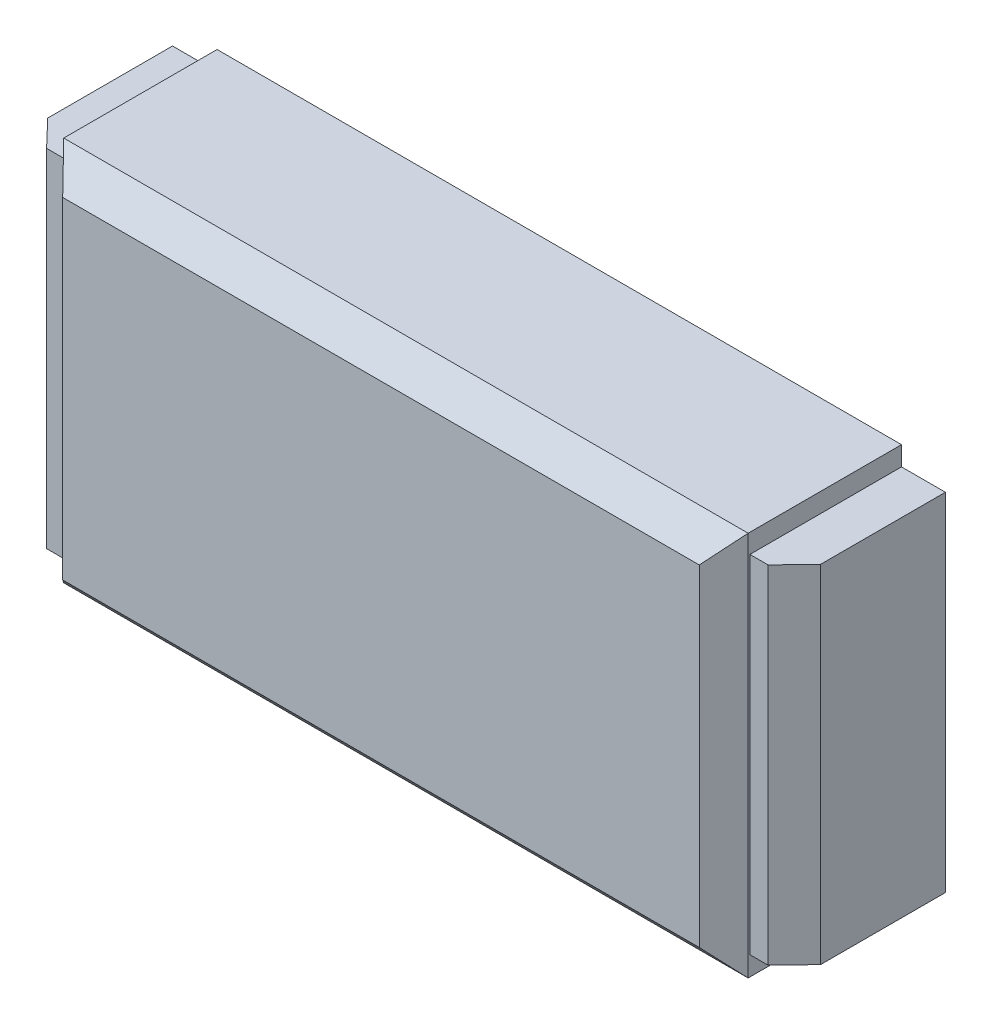
ISO-10303-21;
HEADER;
FILE_DESCRIPTION(('STEP AP214'),'2;1');
FILE_NAME('part.step','',(''),(''),'','','');
FILE_SCHEMA(('AUTOMOTIVE_DESIGN { 1 0 10303 214 1 1 1 1 }'));
ENDSEC;
DATA;
#1=APPLICATION_CONTEXT('core data for automotive mechanical design processes');
#2=APPLICATION_PROTOCOL_DEFINITION('international standard','automotive_design',2000,#1);
#3=PRODUCT_CONTEXT('',#1,'mechanical');
#4=PRODUCT('Part','Part','',(#3));
#5=PRODUCT_RELATED_PRODUCT_CATEGORY('part','',(#4));
#6=PRODUCT_DEFINITION_FORMATION('','',#4);
#7=PRODUCT_DEFINITION_CONTEXT('part definition',#1,'design');
#8=PRODUCT_DEFINITION('design','',#6,#7);
#9=PRODUCT_DEFINITION_SHAPE('','',#8);
#10=(LENGTH_UNIT() NAMED_UNIT(*) SI_UNIT(.MILLI.,.METRE.));
#11=(NAMED_UNIT(*) PLANE_ANGLE_UNIT() SI_UNIT($,.RADIAN.));
#12=(NAMED_UNIT(*) SI_UNIT($,.STERADIAN.) SOLID_ANGLE_UNIT());
#13=UNCERTAINTY_MEASURE_WITH_UNIT(LENGTH_MEASURE(1.E-05),#10,'distance_accuracy_value','');
#14=(GEOMETRIC_REPRESENTATION_CONTEXT(3) GLOBAL_UNCERTAINTY_ASSIGNED_CONTEXT((#13)) GLOBAL_UNIT_ASSIGNED_CONTEXT((#10,
#11,#12)) REPRESENTATION_CONTEXT('',''));
#15=CARTESIAN_POINT('',(0.,0.,0.));
#16=DIRECTION('',(0.,0.,1.));
#17=DIRECTION('',(1.,0.,0.));
#18=AXIS2_PLACEMENT_3D('',#15,#16,#17);
#19=CARTESIAN_POINT('',(3.83298483211547,0.0649199937470257,0.0240552999457575));
#20=DIRECTION('',(-0.999999999994836,1.28751508300798E-06,-2.94461463104024E-06));
#21=DIRECTION('',(-2.94461463104268E-06,0.,0.999999999995665));
#22=AXIS2_PLACEMENT_3D('',#19,#20,#21);
#23=PLANE('',#22);
#24=DIRECTION('',(2.57503016602073E-06,0.999999999996685,0.));
#25=VECTOR('',#24,1.);
#26=CARTESIAN_POINT('',(3.83297982625663,-1.87908008228987,0.0240552999457577));
#27=LINE('',#26,#25);
#28=CARTESIAN_POINT('',(3.83297982625663,-1.87908008228987,0.0240552999457577));
#29=VERTEX_POINT('',#28);
#30=CARTESIAN_POINT('',(3.83298983797431,2.00892006978393,0.0240552999457576));
#31=VERTEX_POINT('',#30);
#32=EDGE_CURVE('P0_E69',#29,#31,#27,.T.);
#33=ORIENTED_EDGE('',*,*,#32,.F.);
#34=DIRECTION('',(0.,0.,-1.));
#35=VECTOR('',#34,1.);
#36=CARTESIAN_POINT('',(3.83297982625663,-1.87908008228987,1.72406004276127));
#37=LINE('',#36,#35);
#38=CARTESIAN_POINT('',(3.83297982625663,-1.87908008228987,1.72406004276127));
#39=VERTEX_POINT('',#38);
#40=EDGE_CURVE('P0_E57',#39,#29,#37,.T.);
#41=ORIENTED_EDGE('',*,*,#40,.F.);
#42=DIRECTION('',(0.,-1.,0.));
#43=VECTOR('',#42,1.);
#44=CARTESIAN_POINT('',(3.83297982625663,2.00892006978393,1.72406004276127));
#45=LINE('',#44,#43);
#46=CARTESIAN_POINT('',(3.83297982625663,2.00892006978393,1.72406004276127));
#47=VERTEX_POINT('',#46);
#48=EDGE_CURVE('P0_E19',#47,#39,#45,.T.);
#49=ORIENTED_EDGE('',*,*,#48,.F.);
#50=DIRECTION('',(-5.88922926200877E-06,0.,0.999999999982659));
#51=VECTOR('',#50,1.);
#52=CARTESIAN_POINT('',(3.83298983797431,2.00892006978393,0.0240552999457577));
#53=LINE('',#52,#51);
#54=EDGE_CURVE('P0_E81',#31,#47,#53,.T.);
#55=ORIENTED_EDGE('',*,*,#54,.F.);
#56=EDGE_LOOP('',(#33,#41,#49,#55));
#57=FACE_BOUND('',#56,.T.);
#58=ADVANCED_FACE('P0_F16',(#57),#23,.T.);
#59=CARTESIAN_POINT('',(0.,0.,1.72406004276127));
#60=DIRECTION('',(0.,0.,1.));
#61=DIRECTION('',(1.,0.,0.));
#62=AXIS2_PLACEMENT_3D('',#59,#60,#61);
#63=PLANE('',#62);
#64=ORIENTED_EDGE('',*,*,#48,.T.);
#65=DIRECTION('',(-1.,0.,0.));
#66=VECTOR('',#65,1.);
#67=CARTESIAN_POINT('',(4.04488993808627,-1.87908008228987,1.72406004276127));
#68=LINE('',#67,#66);
#69=CARTESIAN_POINT('',(4.04488993808627,-1.87908008228987,1.72406004276127));
#70=VERTEX_POINT('',#69);
#71=EDGE_CURVE('P0_E64',#70,#39,#68,.T.);
#72=ORIENTED_EDGE('',*,*,#71,.F.);
#73=DIRECTION('',(0.,-1.,0.));
#74=VECTOR('',#73,1.);
#75=CARTESIAN_POINT('',(4.04488993808627,2.00892006978393,1.72406004276127));
#76=LINE('',#75,#74);
#77=CARTESIAN_POINT('',(4.04488993808627,2.00892006978393,1.72406004276127));
#78=VERTEX_POINT('',#77);
#79=EDGE_CURVE('P0_E87',#78,#70,#76,.T.);
#80=ORIENTED_EDGE('',*,*,#79,.F.);
#81=DIRECTION('',(1.,0.,0.));
#82=VECTOR('',#81,1.);
#83=CARTESIAN_POINT('',(3.83297982625663,2.00892006978393,1.72406004276127));
#84=LINE('',#83,#82);
#85=EDGE_CURVE('P0_E65',#47,#78,#84,.T.);
#86=ORIENTED_EDGE('',*,*,#85,.F.);
#87=EDGE_LOOP('',(#64,#72,#80,#86));
#88=FACE_BOUND('',#87,.T.);
#89=ADVANCED_FACE('P0_F62',(#88),#63,.T.);
#90=CARTESIAN_POINT('',(0.,-1.87908008228987,0.));
#91=DIRECTION('',(0.,-1.,0.));
#92=DIRECTION('',(0.,0.,-1.));
#93=AXIS2_PLACEMENT_3D('',#90,#91,#92);
#94=PLANE('',#93);
#95=DIRECTION('',(-0.99999999999902,0.,-1.40039793707643E-06));
#96=VECTOR('',#95,1.);
#97=CARTESIAN_POINT('',(4.33305976912379,-1.87908008228987,0.0240560002566781));
#98=LINE('',#97,#96);
#99=CARTESIAN_POINT('',(4.33305976912379,-1.87908008228987,0.0240560002566781));
#100=VERTEX_POINT('',#99);
#101=EDGE_CURVE('P0_E71',#100,#29,#98,.T.);
#102=ORIENTED_EDGE('',*,*,#101,.F.);
#103=DIRECTION('',(0.,0.,-1.));
#104=VECTOR('',#103,1.);
#105=CARTESIAN_POINT('',(4.33305976912379,-1.87908008228987,1.42325996421278));
#106=LINE('',#105,#104);
#107=CARTESIAN_POINT('',(4.33305976912379,-1.87908008228987,1.42325996421278));
#108=VERTEX_POINT('',#107);
#109=EDGE_CURVE('P0_E34',#108,#100,#106,.T.);
#110=ORIENTED_EDGE('',*,*,#109,.F.);
#111=DIRECTION('',(0.691784083048146,0.,-0.722104412423325));
#112=VECTOR('',#111,1.);
#113=CARTESIAN_POINT('',(4.04488993808627,-1.87908008228987,1.72406004276127));
#114=LINE('',#113,#112);
#115=EDGE_CURVE('P0_E73',#70,#108,#114,.T.);
#116=ORIENTED_EDGE('',*,*,#115,.F.);
#117=ORIENTED_EDGE('',*,*,#71,.T.);
#118=ORIENTED_EDGE('',*,*,#40,.T.);
#119=EDGE_LOOP('',(#102,#110,#116,#117,#118));
#120=FACE_BOUND('',#119,.T.);
#121=ADVANCED_FACE('P0_F72',(#120),#94,.T.);
#122=CARTESIAN_POINT('',(4.33305976912379,0.0649199937470257,0.0240560002566781));
#123=DIRECTION('',(1.40041195536423E-06,-1.80305151496546E-12,-0.999999999999019));
#124=DIRECTION('',(-0.99999999999902,0.,-1.40041195536423E-06));
#125=AXIS2_PLACEMENT_3D('',#122,#123,#124);
#126=PLANE('',#125);
#127=DIRECTION('',(0.,1.,0.));
#128=VECTOR('',#127,1.);
#129=CARTESIAN_POINT('',(4.33305976912379,-1.87908008228987,0.0240560002566781));
#130=LINE('',#129,#128);
#131=CARTESIAN_POINT('',(4.33305976912379,2.00892006978393,0.0240560002566781));
#132=VERTEX_POINT('',#131);
#133=EDGE_CURVE('P0_E91',#100,#132,#130,.T.);
#134=ORIENTED_EDGE('',*,*,#133,.F.);
#135=ORIENTED_EDGE('',*,*,#101,.T.);
#136=ORIENTED_EDGE('',*,*,#32,.T.);
#137=DIRECTION('',(-0.99999999999902,0.,-1.40042597393269E-06));
#138=VECTOR('',#137,1.);
#139=CARTESIAN_POINT('',(4.33305976912379,2.00892006978393,0.0240560002566781));
#140=LINE('',#139,#138);
#141=EDGE_CURVE('P0_E78',#132,#31,#140,.T.);
#142=ORIENTED_EDGE('',*,*,#141,.F.);
#143=EDGE_LOOP('',(#134,#135,#136,#142));
#144=FACE_BOUND('',#143,.T.);
#145=ADVANCED_FACE('P0_F102',(#144),#126,.T.);
#146=CARTESIAN_POINT('',(0.,2.00892006978393,0.));
#147=DIRECTION('',(0.,-1.,0.));
#148=DIRECTION('',(0.,0.,-1.));
#149=AXIS2_PLACEMENT_3D('',#146,#147,#148);
#150=PLANE('',#149);
#151=DIRECTION('',(0.,0.,1.));
#152=VECTOR('',#151,1.);
#153=CARTESIAN_POINT('',(4.33305976912379,2.00892006978393,0.0240560002566781));
#154=LINE('',#153,#152);
#155=CARTESIAN_POINT('',(4.33305976912379,2.00892006978393,1.42325996421278));
#156=VERTEX_POINT('',#155);
#157=EDGE_CURVE('P0_E25',#132,#156,#154,.T.);
#158=ORIENTED_EDGE('',*,*,#157,.F.);
#159=ORIENTED_EDGE('',*,*,#141,.T.);
#160=ORIENTED_EDGE('',*,*,#54,.T.);
#161=ORIENTED_EDGE('',*,*,#85,.T.);
#162=DIRECTION('',(-0.691784083048146,0.,0.722104412423325));
#163=VECTOR('',#162,1.);
#164=CARTESIAN_POINT('',(4.33305976912379,2.00892006978393,1.42325996421278));
#165=LINE('',#164,#163);
#166=EDGE_CURVE('P0_E86',#156,#78,#165,.T.);
#167=ORIENTED_EDGE('',*,*,#166,.F.);
#168=EDGE_LOOP('',(#158,#159,#160,#161,#167));
#169=FACE_BOUND('',#168,.T.);
#170=ADVANCED_FACE('P0_F105',(#169),#150,.F.);
#171=CARTESIAN_POINT('',(2.97038384276018,0.,2.8456608595825));
#172=DIRECTION('',(0.722104412423325,0.,0.691784083048146));
#173=DIRECTION('',(0.691784083048146,0.,-0.722104412423325));
#174=AXIS2_PLACEMENT_3D('',#171,#172,#173);
#175=PLANE('',#174);
#176=ORIENTED_EDGE('',*,*,#115,.T.);
#177=DIRECTION('',(0.,-1.,0.));
#178=VECTOR('',#177,1.);
#179=CARTESIAN_POINT('',(4.33305976912379,2.00892006978393,1.42325996421278));
#180=LINE('',#179,#178);
#181=EDGE_CURVE('P0_E10',#156,#108,#180,.T.);
#182=ORIENTED_EDGE('',*,*,#181,.F.);
#183=ORIENTED_EDGE('',*,*,#166,.T.);
#184=ORIENTED_EDGE('',*,*,#79,.T.);
#185=EDGE_LOOP('',(#176,#182,#183,#184));
#186=FACE_BOUND('',#185,.T.);
#187=ADVANCED_FACE('P0_F108',(#186),#175,.T.);
#188=CARTESIAN_POINT('',(4.33305976912379,0.,0.));
#189=DIRECTION('',(1.,0.,0.));
#190=DIRECTION('',(0.,0.,-1.));
#191=AXIS2_PLACEMENT_3D('',#188,#189,#190);
#192=PLANE('',#191);
#193=ORIENTED_EDGE('',*,*,#109,.T.);
#194=ORIENTED_EDGE('',*,*,#133,.T.);
#195=ORIENTED_EDGE('',*,*,#157,.T.);
#196=ORIENTED_EDGE('',*,*,#181,.T.);
#197=EDGE_LOOP('',(#193,#194,#195,#196));
#198=FACE_BOUND('',#197,.T.);
#199=ADVANCED_FACE('P0_F98',(#198),#192,.T.);
#200=CLOSED_SHELL('',(#58,#89,#121,#145,#170,#187,#199));
#201=MANIFOLD_SOLID_BREP('P0_B1',#200);
#202=CARTESIAN_POINT('',(0.,2.0089300815016,0.));
#203=DIRECTION('',(0.,1.,0.));
#204=DIRECTION('',(0.,0.,1.));
#205=AXIS2_PLACEMENT_3D('',#202,#203,#204);
#206=PLANE('',#205);
#207=DIRECTION('',(-1.,0.,0.));
#208=VECTOR('',#207,1.);
#209=CARTESIAN_POINT('',(-3.83867998607457,2.0089300815016,1.72404001932591));
#210=LINE('',#209,#208);
#211=CARTESIAN_POINT('',(-3.83867998607457,2.0089300815016,1.72404001932591));
#212=VERTEX_POINT('',#211);
#213=CARTESIAN_POINT('',(-4.04714001342654,2.0089300815016,1.72404001932591));
#214=VERTEX_POINT('',#213);
#215=EDGE_CURVE('P1_E68',#212,#214,#210,.T.);
#216=ORIENTED_EDGE('',*,*,#215,.F.);
#217=DIRECTION('',(0.,0.,1.));
#218=VECTOR('',#217,1.);
#219=CARTESIAN_POINT('',(-3.83867998607457,2.0089300815016,0.0240447006945033));
#220=LINE('',#219,#218);
#221=CARTESIAN_POINT('',(-3.83867998607457,2.0089300815016,0.0240447006945033));
#222=VERTEX_POINT('',#221);
#223=EDGE_CURVE('P1_E57',#222,#212,#220,.T.);
#224=ORIENTED_EDGE('',*,*,#223,.F.);
#225=DIRECTION('',(0.999999999999004,0.,1.41123403875834E-06));
#226=VECTOR('',#225,1.);
#227=CARTESIAN_POINT('',(-4.33492008596659,2.0089300815016,0.0240440003835829));
#228=LINE('',#227,#226);
#229=CARTESIAN_POINT('',(-4.33492008596659,2.0089300815016,0.0240440003835829));
#230=VERTEX_POINT('',#229);
#231=EDGE_CURVE('P1_E20',#230,#222,#228,.T.);
#232=ORIENTED_EDGE('',*,*,#231,.F.);
#233=DIRECTION('',(0.,0.,-1.));
#234=VECTOR('',#233,1.);
#235=CARTESIAN_POINT('',(-4.33492008596659,2.0089300815016,1.42364006023854));
#236=LINE('',#235,#234);
#237=CARTESIAN_POINT('',(-4.33492008596659,2.0089300815016,1.42364006023854));
#238=VERTEX_POINT('',#237);
#239=EDGE_CURVE('P1_E85',#238,#230,#236,.T.);
#240=ORIENTED_EDGE('',*,*,#239,.F.);
#241=DIRECTION('',(-0.691776011342532,0.,-0.722112145120837));
#242=VECTOR('',#241,1.);
#243=CARTESIAN_POINT('',(-4.04714001342654,2.0089300815016,1.72404001932591));
#244=LINE('',#243,#242);
#245=EDGE_CURVE('P1_E79',#214,#238,#244,.T.);
#246=ORIENTED_EDGE('',*,*,#245,.F.);
#247=EDGE_LOOP('',(#216,#224,#232,#240,#246));
#248=FACE_BOUND('',#247,.T.);
#249=ADVANCED_FACE('P1_F17',(#248),#206,.T.);
#250=CARTESIAN_POINT('',(-3.83867998607457,0.0649300054647028,0.0240447006945033));
#251=DIRECTION('',(1.41122013403533E-06,-1.77471215667501E-12,-0.999999999999004));
#252=DIRECTION('',(-0.999999999999004,0.,-1.41122013403533E-06));
#253=AXIS2_PLACEMENT_3D('',#250,#251,#252);
#254=PLANE('',#253);
#255=DIRECTION('',(0.,1.,0.));
#256=VECTOR('',#255,1.);
#257=CARTESIAN_POINT('',(-3.83867998607457,-1.8790700705722,0.0240447006945033));
#258=LINE('',#257,#256);
#259=CARTESIAN_POINT('',(-3.83867998607457,-1.8790700705722,0.0240447006945033));
#260=VERTEX_POINT('',#259);
#261=EDGE_CURVE('P1_E61',#260,#222,#258,.T.);
#262=ORIENTED_EDGE('',*,*,#261,.F.);
#263=DIRECTION('',(0.999999999999004,0.,1.41120622958632E-06));
#264=VECTOR('',#263,1.);
#265=CARTESIAN_POINT('',(-4.33492986485362,-1.8790700705722,0.0240440003835829));
#266=LINE('',#265,#264);
#267=CARTESIAN_POINT('',(-4.33492986485362,-1.8790700705722,0.0240440003835829));
#268=VERTEX_POINT('',#267);
#269=EDGE_CURVE('P1_E35',#268,#260,#266,.T.);
#270=ORIENTED_EDGE('',*,*,#269,.F.);
#271=DIRECTION('',(-2.51514574355551E-06,-0.999999999996837,0.));
#272=VECTOR('',#271,1.);
#273=CARTESIAN_POINT('',(-4.33492008596659,2.0089300815016,0.0240440003835829));
#274=LINE('',#273,#272);
#275=EDGE_CURVE('P1_E63',#230,#268,#274,.T.);
#276=ORIENTED_EDGE('',*,*,#275,.F.);
#277=ORIENTED_EDGE('',*,*,#231,.T.);
#278=EDGE_LOOP('',(#262,#270,#276,#277));
#279=FACE_BOUND('',#278,.T.);
#280=ADVANCED_FACE('P1_F60',(#279),#254,.T.);
#281=CARTESIAN_POINT('',(-3.83868499193341,-1.8790700705722,0.874042360010208));
#282=DIRECTION('',(0.999999999994836,-1.28751508300798E-06,2.94463095496189E-06));
#283=DIRECTION('',(2.94463095496433E-06,0.,-0.999999999995665));
#284=AXIS2_PLACEMENT_3D('',#281,#282,#283);
#285=PLANE('',#284);
#286=DIRECTION('',(-5.88926190985206E-06,0.,0.999999999982658));
#287=VECTOR('',#286,1.);
#288=CARTESIAN_POINT('',(-3.83867998607457,-1.8790700705722,0.0240447006945033));
#289=LINE('',#288,#287);
#290=CARTESIAN_POINT('',(-3.83868999779224,-1.8790700705722,1.72404001932591));
#291=VERTEX_POINT('',#290);
#292=EDGE_CURVE('P1_E73',#260,#291,#289,.T.);
#293=ORIENTED_EDGE('',*,*,#292,.F.);
#294=ORIENTED_EDGE('',*,*,#261,.T.);
#295=ORIENTED_EDGE('',*,*,#223,.T.);
#296=DIRECTION('',(2.57503016602073E-06,0.999999999996685,0.));
#297=VECTOR('',#296,1.);
#298=CARTESIAN_POINT('',(-3.83868999779224,-1.8790700705722,1.72404001932591));
#299=LINE('',#298,#297);
#300=EDGE_CURVE('P1_E70',#291,#212,#299,.T.);
#301=ORIENTED_EDGE('',*,*,#300,.F.);
#302=EDGE_LOOP('',(#293,#294,#295,#301));
#303=FACE_BOUND('',#302,.T.);
#304=ADVANCED_FACE('P1_F71',(#303),#285,.T.);
#305=CARTESIAN_POINT('',(0.,0.,1.72404001932591));
#306=DIRECTION('',(0.,0.,1.));
#307=DIRECTION('',(1.,0.,0.));
#308=AXIS2_PLACEMENT_3D('',#305,#306,#307);
#309=PLANE('',#308);
#310=DIRECTION('',(-1.,0.,0.));
#311=VECTOR('',#310,1.);
#312=CARTESIAN_POINT('',(-3.83868999779224,-1.8790700705722,1.72404001932591));
#313=LINE('',#312,#311);
#314=CARTESIAN_POINT('',(-4.04715025797486,-1.8790700705722,1.72404001932591));
#315=VERTEX_POINT('',#314);
#316=EDGE_CURVE('P1_E92',#291,#315,#313,.T.);
#317=ORIENTED_EDGE('',*,*,#316,.F.);
#318=ORIENTED_EDGE('',*,*,#300,.T.);
#319=ORIENTED_EDGE('',*,*,#215,.T.);
#320=DIRECTION('',(2.63491458848591E-06,0.999999999996529,0.));
#321=VECTOR('',#320,1.);
#322=CARTESIAN_POINT('',(-4.04715025797486,-1.8790700705722,1.72404001932591));
#323=LINE('',#322,#321);
#324=EDGE_CURVE('P1_E77',#315,#214,#323,.T.);
#325=ORIENTED_EDGE('',*,*,#324,.F.);
#326=EDGE_LOOP('',(#317,#318,#319,#325));
#327=FACE_BOUND('',#326,.T.);
#328=ADVANCED_FACE('P1_F104',(#327),#309,.T.);
#329=CARTESIAN_POINT('',(-4.3349249754101,0.0649300054647028,1.42364006023854));
#330=DIRECTION('',(-0.72211242470541,1.85946127688096E-06,0.691775719494849));
#331=DIRECTION('',(0.691775719496045,0.,0.722112424706658));
#332=AXIS2_PLACEMENT_3D('',#329,#330,#331);
#333=PLANE('',#332);
#334=DIRECTION('',(-0.691775427649219,0.,-0.722112704292578));
#335=VECTOR('',#334,1.);
#336=CARTESIAN_POINT('',(-4.04715025797486,-1.8790700705722,1.72404001932591));
#337=LINE('',#336,#335);
#338=CARTESIAN_POINT('',(-4.33492986485362,-1.8790700705722,1.42364006023854));
#339=VERTEX_POINT('',#338);
#340=EDGE_CURVE('P1_E26',#315,#339,#337,.T.);
#341=ORIENTED_EDGE('',*,*,#340,.F.);
#342=ORIENTED_EDGE('',*,*,#324,.T.);
#343=ORIENTED_EDGE('',*,*,#245,.T.);
#344=DIRECTION('',(2.51514574355551E-06,0.999999999996837,0.));
#345=VECTOR('',#344,1.);
#346=CARTESIAN_POINT('',(-4.33492986485362,-1.8790700705722,1.42364006023854));
#347=LINE('',#346,#345);
#348=EDGE_CURVE('P1_E84',#339,#238,#347,.T.);
#349=ORIENTED_EDGE('',*,*,#348,.F.);
#350=EDGE_LOOP('',(#341,#342,#343,#349));
#351=FACE_BOUND('',#350,.T.);
#352=ADVANCED_FACE('P1_F106',(#351),#333,.T.);
#353=CARTESIAN_POINT('',(-4.33492513869111,1.09029685112452E-05,0.));
#354=DIRECTION('',(-0.999999999996837,2.51514574355551E-06,0.));
#355=DIRECTION('',(-2.51514574355551E-06,-0.999999999996837,0.));
#356=AXIS2_PLACEMENT_3D('',#353,#354,#355);
#357=PLANE('',#356);
#358=ORIENTED_EDGE('',*,*,#275,.T.);
#359=DIRECTION('',(0.,0.,-1.));
#360=VECTOR('',#359,1.);
#361=CARTESIAN_POINT('',(-4.33492986485362,-1.8790700705722,1.42364006023854));
#362=LINE('',#361,#360);
#363=EDGE_CURVE('P1_E11',#339,#268,#362,.T.);
#364=ORIENTED_EDGE('',*,*,#363,.F.);
#365=ORIENTED_EDGE('',*,*,#348,.T.);
#366=ORIENTED_EDGE('',*,*,#239,.T.);
#367=EDGE_LOOP('',(#358,#364,#365,#366));
#368=FACE_BOUND('',#367,.T.);
#369=ADVANCED_FACE('P1_F109',(#368),#357,.T.);
#370=CARTESIAN_POINT('',(0.,-1.8790700705722,0.));
#371=DIRECTION('',(0.,1.,0.));
#372=DIRECTION('',(0.,0.,1.));
#373=AXIS2_PLACEMENT_3D('',#370,#371,#372);
#374=PLANE('',#373);
#375=ORIENTED_EDGE('',*,*,#269,.T.);
#376=ORIENTED_EDGE('',*,*,#292,.T.);
#377=ORIENTED_EDGE('',*,*,#316,.T.);
#378=ORIENTED_EDGE('',*,*,#340,.T.);
#379=ORIENTED_EDGE('',*,*,#363,.T.);
#380=EDGE_LOOP('',(#375,#376,#377,#378,#379));
#381=FACE_BOUND('',#380,.T.);
#382=ADVANCED_FACE('P1_F97',(#381),#374,.F.);
#383=CLOSED_SHELL('',(#249,#280,#304,#328,#352,#369,#382));
#384=MANIFOLD_SOLID_BREP('P1_B1',#383);
#385=CARTESIAN_POINT('',(-2.87093185497996,0.,2.75025395369583));
#386=DIRECTION('',(-0.722120846058626,0.,0.691766928732195));
#387=DIRECTION('',(0.691766928732195,0.,0.722120846058626));
#388=AXIS2_PLACEMENT_3D('',#385,#386,#387);
#389=PLANE('',#388);
#390=DIRECTION('',(0.,1.,0.));
#391=VECTOR('',#390,1.);
#392=CARTESIAN_POINT('',(-3.8348501548171,-2.09506996907294,1.74404005520046));
#393=LINE('',#392,#391);
#394=CARTESIAN_POINT('',(-3.8348501548171,-2.09506996907294,1.74404005520046));
#395=VERTEX_POINT('',#394);
#396=CARTESIAN_POINT('',(-3.8348501548171,2.22493009641767,1.74404005520046));
#397=VERTEX_POINT('',#396);
#398=EDGE_CURVE('P2_E20',#395,#397,#393,.T.);
#399=ORIENTED_EDGE('',*,*,#398,.F.);
#400=DIRECTION('',(-0.54549620124834,-0.614964364679721,-0.569431931487599));
#401=VECTOR('',#400,1.);
#402=CARTESIAN_POINT('',(-3.56661016121507,-1.79266999475658,2.02405010350049));
#403=LINE('',#402,#401);
#404=CARTESIAN_POINT('',(-3.56661016121507,-1.79266999475658,2.02405010350049));
#405=VERTEX_POINT('',#404);
#406=EDGE_CURVE('P2_E67',#405,#395,#403,.T.);
#407=ORIENTED_EDGE('',*,*,#406,.F.);
#408=DIRECTION('',(0.,-1.,0.));
#409=VECTOR('',#408,1.);
#410=CARTESIAN_POINT('',(-3.56661016121507,1.92253000568599,2.02405010350049));
#411=LINE('',#410,#409);
#412=CARTESIAN_POINT('',(-3.56661016121507,1.92253000568599,2.02405010350049));
#413=VERTEX_POINT('',#412);
#414=EDGE_CURVE('P2_E70',#413,#405,#411,.T.);
#415=ORIENTED_EDGE('',*,*,#414,.F.);
#416=DIRECTION('',(0.545496121830145,-0.614964511891349,0.569431848584627));
#417=VECTOR('',#416,1.);
#418=CARTESIAN_POINT('',(-3.8348501548171,2.22493009641767,1.74404005520046));
#419=LINE('',#418,#417);
#420=EDGE_CURVE('P2_E63',#397,#413,#419,.T.);
#421=ORIENTED_EDGE('',*,*,#420,.F.);
#422=EDGE_LOOP('',(#399,#407,#415,#421));
#423=FACE_BOUND('',#422,.T.);
#424=ADVANCED_FACE('P2_F17',(#423),#389,.T.);
#425=CARTESIAN_POINT('',(-3.8348501548171,0.,0.));
#426=DIRECTION('',(-1.,0.,0.));
#427=DIRECTION('',(0.,0.,1.));
#428=AXIS2_PLACEMENT_3D('',#425,#426,#427);
#429=PLANE('',#428);
#430=DIRECTION('',(0.,1.,0.));
#431=VECTOR('',#430,1.);
#432=CARTESIAN_POINT('',(-3.8348501548171,-2.09506996907294,0.0240447006945033));
#433=LINE('',#432,#431);
#434=CARTESIAN_POINT('',(-3.8348501548171,-2.09506996907294,0.0240447006945033));
#435=VERTEX_POINT('',#434);
#436=CARTESIAN_POINT('',(-3.8348501548171,2.22493009641767,0.0240447006945033));
#437=VERTEX_POINT('',#436);
#438=EDGE_CURVE('P2_E93',#435,#437,#433,.T.);
#439=ORIENTED_EDGE('',*,*,#438,.F.);
#440=DIRECTION('',(0.,0.,-1.));
#441=VECTOR('',#440,1.);
#442=CARTESIAN_POINT('',(-3.8348501548171,-2.09506996907294,1.74404005520046));
#443=LINE('',#442,#441);
#444=EDGE_CURVE('P2_E86',#395,#435,#443,.T.);
#445=ORIENTED_EDGE('',*,*,#444,.F.);
#446=ORIENTED_EDGE('',*,*,#398,.T.);
#447=DIRECTION('',(0.,0.,1.));
#448=VECTOR('',#447,1.);
#449=CARTESIAN_POINT('',(-3.8348501548171,2.22493009641767,0.0240447006945033));
#450=LINE('',#449,#448);
#451=EDGE_CURVE('P2_E101',#437,#397,#450,.T.);
#452=ORIENTED_EDGE('',*,*,#451,.F.);
#453=EDGE_LOOP('',(#439,#445,#446,#452));
#454=FACE_BOUND('',#453,.T.);
#455=ADVANCED_FACE('P2_F133',(#454),#429,.T.);
#456=CARTESIAN_POINT('',(3.70652007404715,-1.94387999363244,1.88405509106815));
#457=DIRECTION('',(-1.91005376151348E-06,-0.67940811035651,0.733760600998818));
#458=DIRECTION('',(0.,-0.733760601000157,-0.67940811035775));
#459=AXIS2_PLACEMENT_3D('',#456,#457,#458);
#460=PLANE('',#459);
#461=DIRECTION('',(-0.999999999995747,1.30437503463243E-06,-2.60875006926487E-06));
#462=VECTOR('',#461,1.);
#463=CARTESIAN_POINT('',(3.84063995443285,-2.09507998079062,1.74406007863581));
#464=LINE('',#463,#462);
#465=CARTESIAN_POINT('',(3.84063995443285,-2.09507998079062,1.74406007863581));
#466=VERTEX_POINT('',#465);
#467=EDGE_CURVE('P2_E35',#466,#395,#464,.T.);
#468=ORIENTED_EDGE('',*,*,#467,.F.);
#469=DIRECTION('',(0.545508517179408,-0.614978782824802,-0.569404561239238));
#470=VECTOR('',#469,1.);
#471=CARTESIAN_POINT('',(3.57240019366145,-1.79268000647426,2.02405010350049));
#472=LINE('',#471,#470);
#473=CARTESIAN_POINT('',(3.57240019366145,-1.79268000647426,2.02405010350049));
#474=VERTEX_POINT('',#473);
#475=EDGE_CURVE('P2_E78',#474,#466,#472,.T.);
#476=ORIENTED_EDGE('',*,*,#475,.F.);
#477=DIRECTION('',(0.999999999999017,-1.40239573546321E-06,0.));
#478=VECTOR('',#477,1.);
#479=CARTESIAN_POINT('',(-3.56661016121507,-1.79266999475658,2.02405010350049));
#480=LINE('',#479,#478);
#481=EDGE_CURVE('P2_E75',#405,#474,#480,.T.);
#482=ORIENTED_EDGE('',*,*,#481,.F.);
#483=ORIENTED_EDGE('',*,*,#406,.T.);
#484=EDGE_LOOP('',(#468,#476,#482,#483));
#485=FACE_BOUND('',#484,.T.);
#486=ADVANCED_FACE('P2_F76',(#485),#460,.T.);
#487=CARTESIAN_POINT('',(3.70653008576483,2.07372003933415,1.88405509106815));
#488=DIRECTION('',(-7.34636679058502E-08,0.679407969536992,0.733760731389747));
#489=DIRECTION('',(0.,-0.733760731389749,0.679407969536994));
#490=AXIS2_PLACEMENT_3D('',#487,#488,#489);
#491=PLANE('',#490);
#492=DIRECTION('',(-0.545508437755695,-0.614978930035684,0.569404478336364));
#493=VECTOR('',#492,1.);
#494=CARTESIAN_POINT('',(3.84064996615052,2.22492008469999,1.74406007863581));
#495=LINE('',#494,#493);
#496=CARTESIAN_POINT('',(3.84064996615052,2.22492008469999,1.74406007863581));
#497=VERTEX_POINT('',#496);
#498=CARTESIAN_POINT('',(3.57241020537913,1.92251999396831,2.02405010350049));
#499=VERTEX_POINT('',#498);
#500=EDGE_CURVE('P2_E107',#497,#499,#495,.T.);
#501=ORIENTED_EDGE('',*,*,#500,.F.);
#502=DIRECTION('',(0.999999999995747,-1.30437333324042E-06,2.60874666648085E-06));
#503=VECTOR('',#502,1.);
#504=CARTESIAN_POINT('',(-3.8348501548171,2.22493009641767,1.74404005520046));
#505=LINE('',#504,#503);
#506=EDGE_CURVE('P2_E98',#397,#497,#505,.T.);
#507=ORIENTED_EDGE('',*,*,#506,.F.);
#508=ORIENTED_EDGE('',*,*,#420,.T.);
#509=DIRECTION('',(-0.999999999999017,1.40239376875217E-06,0.));
#510=VECTOR('',#509,1.);
#511=CARTESIAN_POINT('',(3.57241020537913,1.92251999396831,2.02405010350049));
#512=LINE('',#511,#510);
#513=EDGE_CURVE('P2_E82',#499,#413,#512,.T.);
#514=ORIENTED_EDGE('',*,*,#513,.F.);
#515=EDGE_LOOP('',(#501,#507,#508,#514));
#516=FACE_BOUND('',#515,.T.);
#517=ADVANCED_FACE('P2_F139',(#516),#491,.T.);
#518=CARTESIAN_POINT('',(0.,0.,2.02405010350049));
#519=DIRECTION('',(0.,0.,1.));
#520=DIRECTION('',(1.,0.,0.));
#521=AXIS2_PLACEMENT_3D('',#518,#519,#520);
#522=PLANE('',#521);
#523=ORIENTED_EDGE('',*,*,#481,.T.);
#524=DIRECTION('',(-2.69479911603344E-06,-0.999999999996369,0.));
#525=VECTOR('',#524,1.);
#526=CARTESIAN_POINT('',(3.57241020537913,1.92251999396831,2.02405010350049));
#527=LINE('',#526,#525);
#528=EDGE_CURVE('P2_E108',#499,#474,#527,.T.);
#529=ORIENTED_EDGE('',*,*,#528,.F.);
#530=ORIENTED_EDGE('',*,*,#513,.T.);
#531=ORIENTED_EDGE('',*,*,#414,.T.);
#532=EDGE_LOOP('',(#523,#529,#530,#531));
#533=FACE_BOUND('',#532,.T.);
#534=ADVANCED_FACE('P2_F84',(#533),#522,.T.);
#535=CARTESIAN_POINT('',(-2.73276348806579E-06,-2.09507497115218,0.));
#536=DIRECTION('',(-1.30437503463687E-06,-0.999999999999149,0.));
#537=DIRECTION('',(0.999999999999149,-1.30437503463687E-06,0.));
#538=AXIS2_PLACEMENT_3D('',#535,#536,#537);
#539=PLANE('',#538);
#540=DIRECTION('',(-0.999999999998196,1.30437503463563E-06,-1.38092175269292E-06));
#541=VECTOR('',#540,1.);
#542=CARTESIAN_POINT('',(3.84063995443285,-2.09507998079062,0.0240552999457577));
#543=LINE('',#542,#541);
#544=CARTESIAN_POINT('',(3.84063995443285,-2.09507998079062,0.0240552999457577));
#545=VERTEX_POINT('',#544);
#546=EDGE_CURVE('P2_E91',#545,#435,#543,.T.);
#547=ORIENTED_EDGE('',*,*,#546,.F.);
#548=DIRECTION('',(0.,0.,-1.));
#549=VECTOR('',#548,1.);
#550=CARTESIAN_POINT('',(3.84063995443285,-2.09507998079062,1.74406007863581));
#551=LINE('',#550,#549);
#552=EDGE_CURVE('P2_E110',#466,#545,#551,.T.);
#553=ORIENTED_EDGE('',*,*,#552,.F.);
#554=ORIENTED_EDGE('',*,*,#467,.T.);
#555=ORIENTED_EDGE('',*,*,#444,.T.);
#556=EDGE_LOOP('',(#547,#553,#554,#555));
#557=FACE_BOUND('',#556,.T.);
#558=ADVANCED_FACE('P2_F129',(#557),#539,.T.);
#559=CARTESIAN_POINT('',(-3.32111630645626E-08,0.,0.0240499963157496));
#560=DIRECTION('',(1.38092175268992E-06,-3.2003237297521E-12,-0.999999999999047));
#561=DIRECTION('',(-0.999999999999047,0.,-1.38092175268992E-06));
#562=AXIS2_PLACEMENT_3D('',#559,#560,#561);
#563=PLANE('',#562);
#564=DIRECTION('',(2.31752720493362E-06,0.999999999997315,0.));
#565=VECTOR('',#564,1.);
#566=CARTESIAN_POINT('',(3.84063995443285,-2.09507998079062,0.0240552999457577));
#567=LINE('',#566,#565);
#568=CARTESIAN_POINT('',(3.84064996615052,2.22492008469999,0.0240552999457577));
#569=VERTEX_POINT('',#568);
#570=EDGE_CURVE('P2_E114',#545,#569,#567,.T.);
#571=ORIENTED_EDGE('',*,*,#570,.F.);
#572=ORIENTED_EDGE('',*,*,#546,.T.);
#573=ORIENTED_EDGE('',*,*,#438,.T.);
#574=DIRECTION('',(-0.999999999998196,1.30437333324362E-06,-1.38091995145541E-06));
#575=VECTOR('',#574,1.);
#576=CARTESIAN_POINT('',(3.84064996615052,2.22492008469999,0.0240552999457577));
#577=LINE('',#576,#575);
#578=EDGE_CURVE('P2_E95',#569,#437,#577,.T.);
#579=ORIENTED_EDGE('',*,*,#578,.F.);
#580=EDGE_LOOP('',(#571,#572,#573,#579));
#581=FACE_BOUND('',#580,.T.);
#582=ADVANCED_FACE('P2_F125',(#581),#563,.T.);
#583=CARTESIAN_POINT('',(2.90213296152374E-06,2.2249250943376,0.));
#584=DIRECTION('',(1.30437333324486E-06,0.999999999999149,0.));
#585=DIRECTION('',(-0.999999999999149,1.30437333324486E-06,0.));
#586=AXIS2_PLACEMENT_3D('',#583,#584,#585);
#587=PLANE('',#586);
#588=DIRECTION('',(0.,0.,1.));
#589=VECTOR('',#588,1.);
#590=CARTESIAN_POINT('',(3.84064996615052,2.22492008469999,0.0240552999457577));
#591=LINE('',#590,#589);
#592=EDGE_CURVE('P2_E26',#569,#497,#591,.T.);
#593=ORIENTED_EDGE('',*,*,#592,.F.);
#594=ORIENTED_EDGE('',*,*,#578,.T.);
#595=ORIENTED_EDGE('',*,*,#451,.T.);
#596=ORIENTED_EDGE('',*,*,#506,.T.);
#597=EDGE_LOOP('',(#593,#594,#595,#596));
#598=FACE_BOUND('',#597,.T.);
#599=ADVANCED_FACE('P2_F135',(#598),#587,.T.);
#600=CARTESIAN_POINT('',(3.70652007404715,-1.94387999363244,1.88405509106815));
#601=DIRECTION('',(0.722096433400815,-1.79943886089713E-06,0.691792411686182));
#602=DIRECTION('',(0.691792411687302,0.,-0.722096433401984));
#603=AXIS2_PLACEMENT_3D('',#600,#601,#602);
#604=PLANE('',#603);
#605=ORIENTED_EDGE('',*,*,#475,.T.);
#606=DIRECTION('',(-2.31752720493362E-06,-0.999999999997315,0.));
#607=VECTOR('',#606,1.);
#608=CARTESIAN_POINT('',(3.84064996615052,2.22492008469999,1.74406007863581));
#609=LINE('',#608,#607);
#610=EDGE_CURVE('P2_E11',#497,#466,#609,.T.);
#611=ORIENTED_EDGE('',*,*,#610,.F.);
#612=ORIENTED_EDGE('',*,*,#500,.T.);
#613=ORIENTED_EDGE('',*,*,#528,.T.);
#614=EDGE_LOOP('',(#605,#611,#612,#613));
#615=FACE_BOUND('',#614,.T.);
#616=ADVANCED_FACE('P2_F138',(#615),#604,.T.);
#617=CARTESIAN_POINT('',(3.84064480981707,-8.90079883126208E-06,0.));
#618=DIRECTION('',(0.999999999997315,-2.31752720493362E-06,0.));
#619=DIRECTION('',(2.31752720493362E-06,0.999999999997315,0.));
#620=AXIS2_PLACEMENT_3D('',#617,#618,#619);
#621=PLANE('',#620);
#622=ORIENTED_EDGE('',*,*,#552,.T.);
#623=ORIENTED_EDGE('',*,*,#570,.T.);
#624=ORIENTED_EDGE('',*,*,#592,.T.);
#625=ORIENTED_EDGE('',*,*,#610,.T.);
#626=EDGE_LOOP('',(#622,#623,#624,#625));
#627=FACE_BOUND('',#626,.T.);
#628=ADVANCED_FACE('P2_F121',(#627),#621,.T.);
#629=CLOSED_SHELL('',(#424,#455,#486,#517,#534,#558,#582,#599,#616,#628));
#630=MANIFOLD_SOLID_BREP('P2_B1',#629);
#631=ADVANCED_BREP_SHAPE_REPRESENTATION('',(#18,#201,#384,#630),#14);
#632=SHAPE_DEFINITION_REPRESENTATION(#9,#631);
ENDSEC;
END-ISO-10303-21;
